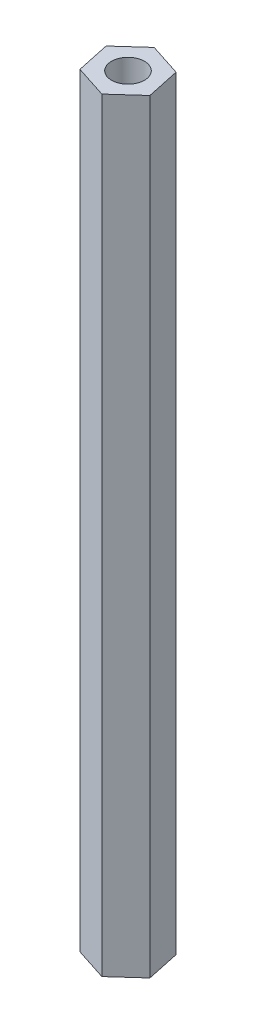
ISO-10303-21;
HEADER;
FILE_DESCRIPTION(('STEP AP214'),'2;1');
FILE_NAME('part.step','',(''),(''),'','','');
FILE_SCHEMA(('AUTOMOTIVE_DESIGN { 1 0 10303 214 1 1 1 1 }'));
ENDSEC;
DATA;
#1=APPLICATION_CONTEXT('core data for automotive mechanical design processes');
#2=APPLICATION_PROTOCOL_DEFINITION('international standard','automotive_design',2000,#1);
#3=PRODUCT_CONTEXT('',#1,'mechanical');
#4=PRODUCT('Part','Part','',(#3));
#5=PRODUCT_RELATED_PRODUCT_CATEGORY('part','',(#4));
#6=PRODUCT_DEFINITION_FORMATION('','',#4);
#7=PRODUCT_DEFINITION_CONTEXT('part definition',#1,'design');
#8=PRODUCT_DEFINITION('design','',#6,#7);
#9=PRODUCT_DEFINITION_SHAPE('','',#8);
#10=(LENGTH_UNIT() NAMED_UNIT(*) SI_UNIT(.MILLI.,.METRE.));
#11=(NAMED_UNIT(*) PLANE_ANGLE_UNIT() SI_UNIT($,.RADIAN.));
#12=(NAMED_UNIT(*) SI_UNIT($,.STERADIAN.) SOLID_ANGLE_UNIT());
#13=UNCERTAINTY_MEASURE_WITH_UNIT(LENGTH_MEASURE(1.E-05),#10,'distance_accuracy_value','');
#14=(GEOMETRIC_REPRESENTATION_CONTEXT(3) GLOBAL_UNCERTAINTY_ASSIGNED_CONTEXT((#13)) GLOBAL_UNIT_ASSIGNED_CONTEXT((#10,
#11,#12)) REPRESENTATION_CONTEXT('',''));
#15=CARTESIAN_POINT('',(0.,0.,0.));
#16=DIRECTION('',(0.,0.,1.));
#17=DIRECTION('',(1.,0.,0.));
#18=AXIS2_PLACEMENT_3D('',#15,#16,#17);
#19=CARTESIAN_POINT('',(0.679103002545253,73.,3.17825724445554));
#20=DIRECTION('',(-0.66992279206715,0.,-0.742430772980858));
#21=DIRECTION('',(-0.742430772980858,0.,0.66992279206715));
#22=AXIS2_PLACEMENT_3D('',#19,#20,#21);
#23=PLANE('',#22);
#24=DIRECTION('',(0.742430772980858,0.,-0.66992279206715));
#25=VECTOR('',#24,1.);
#26=CARTESIAN_POINT('',(0.679103002545253,0.,3.17825724445554));
#27=LINE('',#26,#25);
#28=CARTESIAN_POINT('',(0.679103002545253,0.,3.17825724445554));
#29=VERTEX_POINT('',#28);
#30=CARTESIAN_POINT('',(3.09200301473305,0.,1.00100817023729));
#31=VERTEX_POINT('',#30);
#32=EDGE_CURVE('E130',#29,#31,#27,.T.);
#33=ORIENTED_EDGE('',*,*,#32,.T.);
#34=DIRECTION('',(0.,-1.,0.));
#35=VECTOR('',#34,1.);
#36=CARTESIAN_POINT('',(3.09200301473305,73.,1.00100817023729));
#37=LINE('',#36,#35);
#38=CARTESIAN_POINT('',(3.09200301473305,73.,1.00100817023729));
#39=VERTEX_POINT('',#38);
#40=EDGE_CURVE('E11',#39,#31,#37,.T.);
#41=ORIENTED_EDGE('',*,*,#40,.F.);
#42=DIRECTION('',(0.742430772980858,0.,-0.66992279206715));
#43=VECTOR('',#42,1.);
#44=CARTESIAN_POINT('',(0.679103002545253,73.,3.17825724445554));
#45=LINE('',#44,#43);
#46=CARTESIAN_POINT('',(0.679103002545253,73.,3.17825724445554));
#47=VERTEX_POINT('',#46);
#48=EDGE_CURVE('E141',#47,#39,#45,.T.);
#49=ORIENTED_EDGE('',*,*,#48,.F.);
#50=DIRECTION('',(0.,-1.,0.));
#51=VECTOR('',#50,1.);
#52=CARTESIAN_POINT('',(0.679103002545253,73.,3.17825724445554));
#53=LINE('',#52,#51);
#54=EDGE_CURVE('E126',#47,#29,#53,.T.);
#55=ORIENTED_EDGE('',*,*,#54,.T.);
#56=EDGE_LOOP('',(#33,#41,#49,#55));
#57=FACE_BOUND('',#56,.T.);
#58=ADVANCED_FACE('F43',(#57),#23,.F.);
#59=CARTESIAN_POINT('',(3.09200301473305,73.,1.00100817023729));
#60=DIRECTION('',(-0.977925305986315,0.,0.208954770013924));
#61=DIRECTION('',(0.208954770013924,0.,0.977925305986315));
#62=AXIS2_PLACEMENT_3D('',#59,#60,#61);
#63=PLANE('',#62);
#64=DIRECTION('',(-0.208954770013924,0.,-0.977925305986315));
#65=VECTOR('',#64,1.);
#66=CARTESIAN_POINT('',(3.09200301473305,0.,1.00100817023729));
#67=LINE('',#66,#65);
#68=CARTESIAN_POINT('',(2.41290001218779,0.,-2.17724907421825));
#69=VERTEX_POINT('',#68);
#70=EDGE_CURVE('E133',#31,#69,#67,.T.);
#71=ORIENTED_EDGE('',*,*,#70,.T.);
#72=DIRECTION('',(0.,-1.,0.));
#73=VECTOR('',#72,1.);
#74=CARTESIAN_POINT('',(2.41290001218779,73.,-2.17724907421825));
#75=LINE('',#74,#73);
#76=CARTESIAN_POINT('',(2.41290001218779,73.,-2.17724907421825));
#77=VERTEX_POINT('',#76);
#78=EDGE_CURVE('E51',#77,#69,#75,.T.);
#79=ORIENTED_EDGE('',*,*,#78,.F.);
#80=DIRECTION('',(-0.208954770013924,0.,-0.977925305986315));
#81=VECTOR('',#80,1.);
#82=CARTESIAN_POINT('',(3.09200301473305,73.,1.00100817023729));
#83=LINE('',#82,#81);
#84=EDGE_CURVE('E97',#39,#77,#83,.T.);
#85=ORIENTED_EDGE('',*,*,#84,.F.);
#86=ORIENTED_EDGE('',*,*,#40,.T.);
#87=EDGE_LOOP('',(#71,#79,#85,#86));
#88=FACE_BOUND('',#87,.T.);
#89=ADVANCED_FACE('F166',(#88),#63,.F.);
#90=CARTESIAN_POINT('',(2.41290001218779,73.,-2.17724907421825));
#91=DIRECTION('',(-0.308002513919165,0.,0.951385542994781));
#92=DIRECTION('',(0.951385542994781,0.,0.308002513919165));
#93=AXIS2_PLACEMENT_3D('',#90,#91,#92);
#94=PLANE('',#93);
#95=DIRECTION('',(-0.951385542994781,0.,-0.308002513919165));
#96=VECTOR('',#95,1.);
#97=CARTESIAN_POINT('',(2.41290001218779,0.,-2.17724907421825));
#98=LINE('',#97,#96);
#99=CARTESIAN_POINT('',(-0.679103002545253,0.,-3.17825724445554));
#100=VERTEX_POINT('',#99);
#101=EDGE_CURVE('E136',#69,#100,#98,.T.);
#102=ORIENTED_EDGE('',*,*,#101,.T.);
#103=DIRECTION('',(0.,-1.,0.));
#104=VECTOR('',#103,1.);
#105=CARTESIAN_POINT('',(-0.679103002545253,73.,-3.17825724445554));
#106=LINE('',#105,#104);
#107=CARTESIAN_POINT('',(-0.679103002545253,73.,-3.17825724445554));
#108=VERTEX_POINT('',#107);
#109=EDGE_CURVE('E121',#108,#100,#106,.T.);
#110=ORIENTED_EDGE('',*,*,#109,.F.);
#111=DIRECTION('',(-0.951385542994781,0.,-0.308002513919165));
#112=VECTOR('',#111,1.);
#113=CARTESIAN_POINT('',(2.41290001218779,73.,-2.17724907421825));
#114=LINE('',#113,#112);
#115=EDGE_CURVE('E112',#77,#108,#114,.T.);
#116=ORIENTED_EDGE('',*,*,#115,.F.);
#117=ORIENTED_EDGE('',*,*,#78,.T.);
#118=EDGE_LOOP('',(#102,#110,#116,#117));
#119=FACE_BOUND('',#118,.T.);
#120=ADVANCED_FACE('F147',(#119),#94,.F.);
#121=CARTESIAN_POINT('',(-0.679103002545253,73.,-3.17825724445554));
#122=DIRECTION('',(0.66992279206715,0.,0.742430772980857));
#123=DIRECTION('',(0.742430772980857,0.,-0.66992279206715));
#124=AXIS2_PLACEMENT_3D('',#121,#122,#123);
#125=PLANE('',#124);
#126=DIRECTION('',(-0.742430772980857,0.,0.66992279206715));
#127=VECTOR('',#126,1.);
#128=CARTESIAN_POINT('',(-0.679103002545253,0.,-3.17825724445554));
#129=LINE('',#128,#127);
#130=CARTESIAN_POINT('',(-3.09200301473305,0.,-1.00100817023729));
#131=VERTEX_POINT('',#130);
#132=EDGE_CURVE('E120',#100,#131,#129,.T.);
#133=ORIENTED_EDGE('',*,*,#132,.T.);
#134=DIRECTION('',(0.,-1.,0.));
#135=VECTOR('',#134,1.);
#136=CARTESIAN_POINT('',(-3.09200301473305,73.,-1.00100817023729));
#137=LINE('',#136,#135);
#138=CARTESIAN_POINT('',(-3.09200301473305,73.,-1.00100817023729));
#139=VERTEX_POINT('',#138);
#140=EDGE_CURVE('E117',#139,#131,#137,.T.);
#141=ORIENTED_EDGE('',*,*,#140,.F.);
#142=DIRECTION('',(-0.742430772980857,0.,0.66992279206715));
#143=VECTOR('',#142,1.);
#144=CARTESIAN_POINT('',(-0.679103002545253,73.,-3.17825724445554));
#145=LINE('',#144,#143);
#146=EDGE_CURVE('E106',#108,#139,#145,.T.);
#147=ORIENTED_EDGE('',*,*,#146,.F.);
#148=ORIENTED_EDGE('',*,*,#109,.T.);
#149=EDGE_LOOP('',(#133,#141,#147,#148));
#150=FACE_BOUND('',#149,.T.);
#151=ADVANCED_FACE('F118',(#150),#125,.F.);
#152=CARTESIAN_POINT('',(-3.09200301473305,73.,-1.00100817023729));
#153=DIRECTION('',(0.977925305986315,0.,-0.208954770013923));
#154=DIRECTION('',(-0.208954770013923,0.,-0.977925305986315));
#155=AXIS2_PLACEMENT_3D('',#152,#153,#154);
#156=PLANE('',#155);
#157=DIRECTION('',(0.208954770013923,0.,0.977925305986315));
#158=VECTOR('',#157,1.);
#159=CARTESIAN_POINT('',(-3.09200301473305,0.,-1.00100817023729));
#160=LINE('',#159,#158);
#161=CARTESIAN_POINT('',(-2.4129000121878,0.,2.17724907421825));
#162=VERTEX_POINT('',#161);
#163=EDGE_CURVE('E83',#131,#162,#160,.T.);
#164=ORIENTED_EDGE('',*,*,#163,.T.);
#165=DIRECTION('',(0.,-1.,0.));
#166=VECTOR('',#165,1.);
#167=CARTESIAN_POINT('',(-2.4129000121878,73.,2.17724907421825));
#168=LINE('',#167,#166);
#169=CARTESIAN_POINT('',(-2.4129000121878,73.,2.17724907421825));
#170=VERTEX_POINT('',#169);
#171=EDGE_CURVE('E122',#170,#162,#168,.T.);
#172=ORIENTED_EDGE('',*,*,#171,.F.);
#173=DIRECTION('',(0.208954770013923,0.,0.977925305986315));
#174=VECTOR('',#173,1.);
#175=CARTESIAN_POINT('',(-3.09200301473305,73.,-1.00100817023729));
#176=LINE('',#175,#174);
#177=EDGE_CURVE('E110',#139,#170,#176,.T.);
#178=ORIENTED_EDGE('',*,*,#177,.F.);
#179=ORIENTED_EDGE('',*,*,#140,.T.);
#180=EDGE_LOOP('',(#164,#172,#178,#179));
#181=FACE_BOUND('',#180,.T.);
#182=ADVANCED_FACE('F124',(#181),#156,.F.);
#183=CARTESIAN_POINT('',(-2.4129000121878,73.,2.17724907421825));
#184=DIRECTION('',(0.308002513919165,0.,-0.951385542994781));
#185=DIRECTION('',(-0.951385542994781,0.,-0.308002513919165));
#186=AXIS2_PLACEMENT_3D('',#183,#184,#185);
#187=PLANE('',#186);
#188=DIRECTION('',(0.951385542994781,0.,0.308002513919165));
#189=VECTOR('',#188,1.);
#190=CARTESIAN_POINT('',(-2.4129000121878,0.,2.17724907421825));
#191=LINE('',#190,#189);
#192=EDGE_CURVE('E89',#162,#29,#191,.T.);
#193=ORIENTED_EDGE('',*,*,#192,.T.);
#194=ORIENTED_EDGE('',*,*,#54,.F.);
#195=DIRECTION('',(0.951385542994781,0.,0.308002513919165));
#196=VECTOR('',#195,1.);
#197=CARTESIAN_POINT('',(-2.4129000121878,73.,2.17724907421825));
#198=LINE('',#197,#196);
#199=EDGE_CURVE('E59',#170,#47,#198,.T.);
#200=ORIENTED_EDGE('',*,*,#199,.F.);
#201=ORIENTED_EDGE('',*,*,#171,.T.);
#202=EDGE_LOOP('',(#193,#194,#200,#201));
#203=FACE_BOUND('',#202,.T.);
#204=ADVANCED_FACE('F154',(#203),#187,.F.);
#205=CARTESIAN_POINT('',(0.,73.,0.));
#206=DIRECTION('',(0.,1.,0.));
#207=DIRECTION('',(0.,0.,1.));
#208=AXIS2_PLACEMENT_3D('',#205,#206,#207);
#209=PLANE('',#208);
#210=CARTESIAN_POINT('',(0.,73.,0.));
#211=DIRECTION('',(0.,1.,0.));
#212=DIRECTION('',(0.,0.,1.));
#213=AXIS2_PLACEMENT_3D('',#210,#211,#212);
#214=CIRCLE('',#213,1.57499999999999);
#215=CARTESIAN_POINT('',(0.,73.,1.57499999999999));
#216=VERTEX_POINT('',#215);
#217=EDGE_CURVE('E308',#216,#216,#214,.T.);
#218=ORIENTED_EDGE('',*,*,#217,.F.);
#219=EDGE_LOOP('',(#218));
#220=FACE_BOUND('',#219,.T.);
#221=ORIENTED_EDGE('',*,*,#48,.T.);
#222=ORIENTED_EDGE('',*,*,#84,.T.);
#223=ORIENTED_EDGE('',*,*,#115,.T.);
#224=ORIENTED_EDGE('',*,*,#146,.T.);
#225=ORIENTED_EDGE('',*,*,#177,.T.);
#226=ORIENTED_EDGE('',*,*,#199,.T.);
#227=EDGE_LOOP('',(#221,#222,#223,#224,#225,#226));
#228=FACE_BOUND('',#227,.T.);
#229=ADVANCED_FACE('F108',(#220,#228),#209,.T.);
#230=CARTESIAN_POINT('',(0.,0.,0.));
#231=DIRECTION('',(0.,1.,0.));
#232=DIRECTION('',(0.,0.,1.));
#233=AXIS2_PLACEMENT_3D('',#230,#231,#232);
#234=PLANE('',#233);
#235=CARTESIAN_POINT('',(0.,0.,0.));
#236=DIRECTION('',(0.,-1.,0.));
#237=DIRECTION('',(0.,0.,-1.));
#238=AXIS2_PLACEMENT_3D('',#235,#236,#237);
#239=CIRCLE('',#238,1.57499999999999);
#240=CARTESIAN_POINT('',(0.,0.,-1.57499999999999));
#241=VERTEX_POINT('',#240);
#242=EDGE_CURVE('E310',#241,#241,#239,.T.);
#243=ORIENTED_EDGE('',*,*,#242,.F.);
#244=EDGE_LOOP('',(#243));
#245=FACE_BOUND('',#244,.T.);
#246=ORIENTED_EDGE('',*,*,#32,.F.);
#247=ORIENTED_EDGE('',*,*,#192,.F.);
#248=ORIENTED_EDGE('',*,*,#163,.F.);
#249=ORIENTED_EDGE('',*,*,#132,.F.);
#250=ORIENTED_EDGE('',*,*,#101,.F.);
#251=ORIENTED_EDGE('',*,*,#70,.F.);
#252=EDGE_LOOP('',(#246,#247,#248,#249,#250,#251));
#253=FACE_BOUND('',#252,.T.);
#254=ADVANCED_FACE('F150',(#245,#253),#234,.F.);
#255=CARTESIAN_POINT('',(0.,10.,0.));
#256=DIRECTION('',(0.,-1.,0.));
#257=DIRECTION('',(0.,0.,-1.));
#258=AXIS2_PLACEMENT_3D('',#255,#256,#257);
#259=CONICAL_SURFACE('',#258,1.575,1.02974425867665);
#260=CARTESIAN_POINT('',(0.,10.9463554749684,0.));
#261=VERTEX_POINT('',#260);
#262=VERTEX_LOOP('',#261);
#263=FACE_BOUND('',#262,.T.);
#264=CARTESIAN_POINT('',(0.,10.,0.));
#265=DIRECTION('',(0.,-1.,0.));
#266=DIRECTION('',(0.,0.,-1.));
#267=AXIS2_PLACEMENT_3D('',#264,#265,#266);
#268=CIRCLE('',#267,1.575);
#269=CARTESIAN_POINT('',(0.,10.,-1.575));
#270=VERTEX_POINT('',#269);
#271=EDGE_CURVE('E134',#270,#270,#268,.T.);
#272=ORIENTED_EDGE('',*,*,#271,.T.);
#273=EDGE_LOOP('',(#272));
#274=FACE_BOUND('',#273,.T.);
#275=ADVANCED_FACE('F201',(#263,#274),#259,.F.);
#276=CARTESIAN_POINT('',(0.,0.,0.));
#277=DIRECTION('',(0.,-1.,0.));
#278=DIRECTION('',(0.,0.,-1.));
#279=AXIS2_PLACEMENT_3D('',#276,#277,#278);
#280=CYLINDRICAL_SURFACE('',#279,1.57499999999999);
#281=ORIENTED_EDGE('',*,*,#271,.F.);
#282=EDGE_LOOP('',(#281));
#283=FACE_BOUND('',#282,.T.);
#284=ORIENTED_EDGE('',*,*,#242,.T.);
#285=EDGE_LOOP('',(#284));
#286=FACE_BOUND('',#285,.T.);
#287=ADVANCED_FACE('F213',(#283,#286),#280,.F.);
#288=CARTESIAN_POINT('',(0.,63.,0.));
#289=DIRECTION('',(0.,1.,0.));
#290=DIRECTION('',(0.,0.,1.));
#291=AXIS2_PLACEMENT_3D('',#288,#289,#290);
#292=CONICAL_SURFACE('',#291,1.575,1.02974425867665);
#293=CARTESIAN_POINT('',(0.,62.0536445250316,0.));
#294=VERTEX_POINT('',#293);
#295=VERTEX_LOOP('',#294);
#296=FACE_BOUND('',#295,.T.);
#297=CARTESIAN_POINT('',(0.,63.,0.));
#298=DIRECTION('',(0.,1.,0.));
#299=DIRECTION('',(0.,0.,1.));
#300=AXIS2_PLACEMENT_3D('',#297,#298,#299);
#301=CIRCLE('',#300,1.575);
#302=CARTESIAN_POINT('',(0.,63.,1.575));
#303=VERTEX_POINT('',#302);
#304=EDGE_CURVE('E305',#303,#303,#301,.T.);
#305=ORIENTED_EDGE('',*,*,#304,.T.);
#306=EDGE_LOOP('',(#305));
#307=FACE_BOUND('',#306,.T.);
#308=ADVANCED_FACE('F225',(#296,#307),#292,.F.);
#309=CARTESIAN_POINT('',(0.,73.,0.));
#310=DIRECTION('',(0.,1.,0.));
#311=DIRECTION('',(0.,0.,1.));
#312=AXIS2_PLACEMENT_3D('',#309,#310,#311);
#313=CYLINDRICAL_SURFACE('',#312,1.57499999999999);
#314=ORIENTED_EDGE('',*,*,#304,.F.);
#315=EDGE_LOOP('',(#314));
#316=FACE_BOUND('',#315,.T.);
#317=ORIENTED_EDGE('',*,*,#217,.T.);
#318=EDGE_LOOP('',(#317));
#319=FACE_BOUND('',#318,.T.);
#320=ADVANCED_FACE('F246',(#316,#319),#313,.F.);
#321=CLOSED_SHELL('',(#58,#89,#120,#151,#182,#204,#229,#254,#275,#287,#308,#320));
#322=MANIFOLD_SOLID_BREP('B2',#321);
#323=ADVANCED_BREP_SHAPE_REPRESENTATION('',(#18,#322),#14);
#324=SHAPE_DEFINITION_REPRESENTATION(#9,#323);
ENDSEC;
END-ISO-10303-21;
